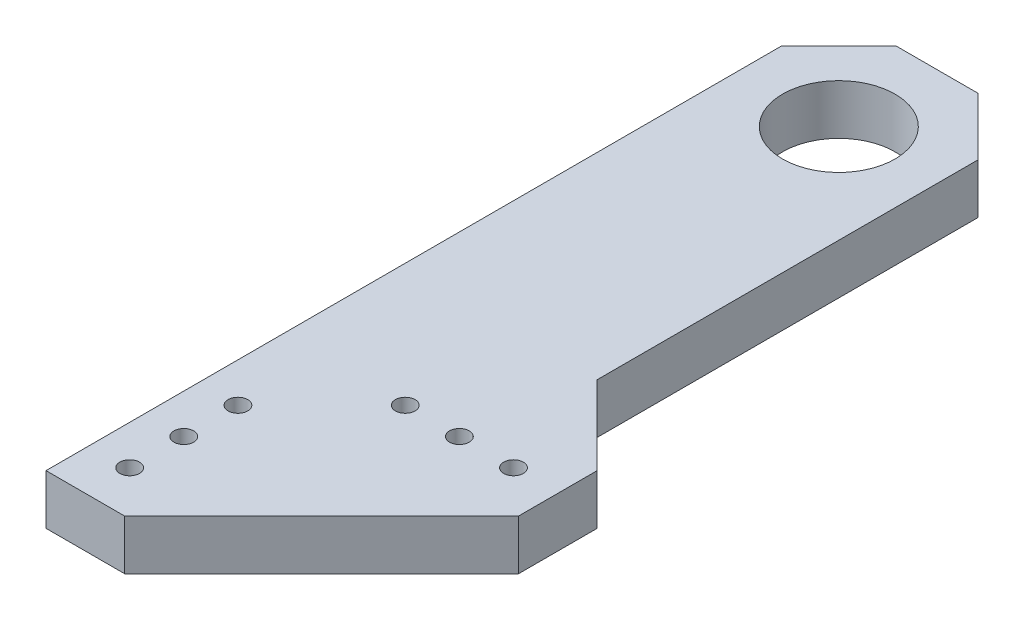
ISO-10303-21;
HEADER;
FILE_DESCRIPTION(('STEP AP214'),'2;1');
FILE_NAME('part.step','',(''),(''),'','','');
FILE_SCHEMA(('AUTOMOTIVE_DESIGN { 1 0 10303 214 1 1 1 1 }'));
ENDSEC;
DATA;
#1=APPLICATION_CONTEXT('core data for automotive mechanical design processes');
#2=APPLICATION_PROTOCOL_DEFINITION('international standard','automotive_design',2000,#1);
#3=PRODUCT_CONTEXT('',#1,'mechanical');
#4=PRODUCT('Part','Part','',(#3));
#5=PRODUCT_RELATED_PRODUCT_CATEGORY('part','',(#4));
#6=PRODUCT_DEFINITION_FORMATION('','',#4);
#7=PRODUCT_DEFINITION_CONTEXT('part definition',#1,'design');
#8=PRODUCT_DEFINITION('design','',#6,#7);
#9=PRODUCT_DEFINITION_SHAPE('','',#8);
#10=(LENGTH_UNIT() NAMED_UNIT(*) SI_UNIT(.MILLI.,.METRE.));
#11=(NAMED_UNIT(*) PLANE_ANGLE_UNIT() SI_UNIT($,.RADIAN.));
#12=(NAMED_UNIT(*) SI_UNIT($,.STERADIAN.) SOLID_ANGLE_UNIT());
#13=UNCERTAINTY_MEASURE_WITH_UNIT(LENGTH_MEASURE(1.E-05),#10,'distance_accuracy_value','');
#14=(GEOMETRIC_REPRESENTATION_CONTEXT(3) GLOBAL_UNCERTAINTY_ASSIGNED_CONTEXT((#13)) GLOBAL_UNIT_ASSIGNED_CONTEXT((#10,
#11,#12)) REPRESENTATION_CONTEXT('',''));
#15=CARTESIAN_POINT('',(0.,0.,0.));
#16=DIRECTION('',(0.,0.,1.));
#17=DIRECTION('',(1.,0.,0.));
#18=AXIS2_PLACEMENT_3D('',#15,#16,#17);
#19=CARTESIAN_POINT('',(0.,6.35,0.));
#20=DIRECTION('',(0.,1.,0.));
#21=DIRECTION('',(0.,0.,1.));
#22=AXIS2_PLACEMENT_3D('',#19,#20,#21);
#23=PLANE('',#22);
#24=CARTESIAN_POINT('',(0.,6.35,35.));
#25=DIRECTION('',(0.,1.,0.));
#26=DIRECTION('',(0.,0.,1.));
#27=AXIS2_PLACEMENT_3D('',#24,#25,#26);
#28=CIRCLE('',#27,2.5);
#29=CARTESIAN_POINT('',(0.,6.35,37.5));
#30=VERTEX_POINT('',#29);
#31=EDGE_CURVE('E222',#30,#30,#28,.T.);
#32=ORIENTED_EDGE('',*,*,#31,.F.);
#33=EDGE_LOOP('',(#32));
#34=FACE_BOUND('',#33,.T.);
#35=CARTESIAN_POINT('',(21.25,6.35,0.));
#36=DIRECTION('',(0.,1.,0.));
#37=DIRECTION('',(0.,0.,1.));
#38=AXIS2_PLACEMENT_3D('',#35,#36,#37);
#39=CIRCLE('',#38,2.5);
#40=CARTESIAN_POINT('',(21.25,6.35,2.5));
#41=VERTEX_POINT('',#40);
#42=EDGE_CURVE('E210',#41,#41,#39,.T.);
#43=ORIENTED_EDGE('',*,*,#42,.F.);
#44=EDGE_LOOP('',(#43));
#45=FACE_BOUND('',#44,.T.);
#46=CARTESIAN_POINT('',(48.75,6.35,0.));
#47=DIRECTION('',(0.,1.,0.));
#48=DIRECTION('',(0.,0.,1.));
#49=AXIS2_PLACEMENT_3D('',#46,#47,#48);
#50=CIRCLE('',#49,2.5);
#51=CARTESIAN_POINT('',(48.75,6.35,2.5));
#52=VERTEX_POINT('',#51);
#53=EDGE_CURVE('E198',#52,#52,#50,.T.);
#54=ORIENTED_EDGE('',*,*,#53,.F.);
#55=EDGE_LOOP('',(#54));
#56=FACE_BOUND('',#55,.T.);
#57=DIRECTION('',(0.,0.,1.));
#58=VECTOR('',#57,1.);
#59=CARTESIAN_POINT('',(-9.99999999999998,6.35,-126.725339059327));
#60=LINE('',#59,#58);
#61=CARTESIAN_POINT('',(-9.99999999999998,6.35,-126.725339059327));
#62=VERTEX_POINT('',#61);
#63=CARTESIAN_POINT('',(-10.,6.35,60.));
#64=VERTEX_POINT('',#63);
#65=EDGE_CURVE('E153',#62,#64,#60,.T.);
#66=ORIENTED_EDGE('',*,*,#65,.T.);
#67=DIRECTION('',(1.,0.,0.));
#68=VECTOR('',#67,1.);
#69=CARTESIAN_POINT('',(-10.,6.35,60.));
#70=LINE('',#69,#68);
#71=CARTESIAN_POINT('',(10.,6.35,60.));
#72=VERTEX_POINT('',#71);
#73=EDGE_CURVE('E96',#64,#72,#70,.T.);
#74=ORIENTED_EDGE('',*,*,#73,.T.);
#75=DIRECTION('',(0.707106781186548,0.,-0.707106781186547));
#76=VECTOR('',#75,1.);
#77=CARTESIAN_POINT('',(10.,6.35,60.));
#78=LINE('',#77,#76);
#79=CARTESIAN_POINT('',(60.,6.35,10.0000000000001));
#80=VERTEX_POINT('',#79);
#81=EDGE_CURVE('E171',#72,#80,#78,.T.);
#82=ORIENTED_EDGE('',*,*,#81,.T.);
#83=DIRECTION('',(0.,0.,-1.));
#84=VECTOR('',#83,1.);
#85=CARTESIAN_POINT('',(60.,6.35,10.0000000000001));
#86=LINE('',#85,#84);
#87=CARTESIAN_POINT('',(60.,6.35,-10.));
#88=VERTEX_POINT('',#87);
#89=EDGE_CURVE('E188',#80,#88,#86,.T.);
#90=ORIENTED_EDGE('',*,*,#89,.T.);
#91=DIRECTION('',(-0.707106781186548,0.,-0.707106781186548));
#92=VECTOR('',#91,1.);
#93=CARTESIAN_POINT('',(40.,6.35,-30.));
#94=LINE('',#93,#92);
#95=CARTESIAN_POINT('',(40.,6.35,-30.));
#96=VERTEX_POINT('',#95);
#97=EDGE_CURVE('E187',#88,#96,#94,.T.);
#98=ORIENTED_EDGE('',*,*,#97,.T.);
#99=DIRECTION('',(0.,0.,-1.));
#100=VECTOR('',#99,1.);
#101=CARTESIAN_POINT('',(40.,6.35,-126.725339059327));
#102=LINE('',#101,#100);
#103=CARTESIAN_POINT('',(40.,6.35,-126.725339059327));
#104=VERTEX_POINT('',#103);
#105=EDGE_CURVE('E118',#96,#104,#102,.T.);
#106=ORIENTED_EDGE('',*,*,#105,.T.);
#107=DIRECTION('',(-0.707106781186548,0.,-0.707106781186547));
#108=VECTOR('',#107,1.);
#109=CARTESIAN_POINT('',(25.3553390593274,6.35,-141.37));
#110=LINE('',#109,#108);
#111=CARTESIAN_POINT('',(25.3553390593274,6.35,-141.37));
#112=VERTEX_POINT('',#111);
#113=EDGE_CURVE('E112',#104,#112,#110,.T.);
#114=ORIENTED_EDGE('',*,*,#113,.T.);
#115=DIRECTION('',(-1.,0.,0.));
#116=VECTOR('',#115,1.);
#117=CARTESIAN_POINT('',(25.3553390593274,6.35,-141.37));
#118=LINE('',#117,#116);
#119=CARTESIAN_POINT('',(4.64466094067263,6.35,-141.37));
#120=VERTEX_POINT('',#119);
#121=EDGE_CURVE('E116',#112,#120,#118,.T.);
#122=ORIENTED_EDGE('',*,*,#121,.T.);
#123=DIRECTION('',(-0.707106781186548,0.,0.707106781186547));
#124=VECTOR('',#123,1.);
#125=CARTESIAN_POINT('',(4.64466094067263,6.35,-141.37));
#126=LINE('',#125,#124);
#127=EDGE_CURVE('E50',#120,#62,#126,.T.);
#128=ORIENTED_EDGE('',*,*,#127,.T.);
#129=EDGE_LOOP('',(#66,#74,#82,#90,#98,#106,#114,#122,#128));
#130=FACE_BOUND('',#129,.T.);
#131=CARTESIAN_POINT('',(15.,6.35,-116.37));
#132=DIRECTION('',(0.,1.,0.));
#133=DIRECTION('',(0.,0.,1.));
#134=AXIS2_PLACEMENT_3D('',#131,#132,#133);
#135=CIRCLE('',#134,14.2875);
#136=CARTESIAN_POINT('',(15.,6.35,-102.0825));
#137=VERTEX_POINT('',#136);
#138=EDGE_CURVE('E140',#137,#137,#135,.T.);
#139=ORIENTED_EDGE('',*,*,#138,.F.);
#140=EDGE_LOOP('',(#139));
#141=FACE_BOUND('',#140,.T.);
#142=CARTESIAN_POINT('',(35.,6.35,0.));
#143=DIRECTION('',(0.,1.,0.));
#144=DIRECTION('',(0.,0.,1.));
#145=AXIS2_PLACEMENT_3D('',#142,#143,#144);
#146=CIRCLE('',#145,2.5);
#147=CARTESIAN_POINT('',(35.,6.35,2.5));
#148=VERTEX_POINT('',#147);
#149=EDGE_CURVE('E204',#148,#148,#146,.T.);
#150=ORIENTED_EDGE('',*,*,#149,.F.);
#151=EDGE_LOOP('',(#150));
#152=FACE_BOUND('',#151,.T.);
#153=CARTESIAN_POINT('',(0.,6.35,48.75));
#154=DIRECTION('',(0.,1.,0.));
#155=DIRECTION('',(0.,0.,1.));
#156=AXIS2_PLACEMENT_3D('',#153,#154,#155);
#157=CIRCLE('',#156,2.5);
#158=CARTESIAN_POINT('',(0.,6.35,51.25));
#159=VERTEX_POINT('',#158);
#160=EDGE_CURVE('E216',#159,#159,#157,.T.);
#161=ORIENTED_EDGE('',*,*,#160,.F.);
#162=EDGE_LOOP('',(#161));
#163=FACE_BOUND('',#162,.T.);
#164=CARTESIAN_POINT('',(0.,6.35,21.25));
#165=DIRECTION('',(0.,1.,0.));
#166=DIRECTION('',(0.,0.,1.));
#167=AXIS2_PLACEMENT_3D('',#164,#165,#166);
#168=CIRCLE('',#167,2.5);
#169=CARTESIAN_POINT('',(0.,6.35,23.75));
#170=VERTEX_POINT('',#169);
#171=EDGE_CURVE('E228',#170,#170,#168,.T.);
#172=ORIENTED_EDGE('',*,*,#171,.F.);
#173=EDGE_LOOP('',(#172));
#174=FACE_BOUND('',#173,.T.);
#175=ADVANCED_FACE('F33',(#34,#45,#56,#130,#141,#152,#163,#174),#23,.T.);
#176=CARTESIAN_POINT('',(0.,-6.35,0.));
#177=DIRECTION('',(0.,1.,0.));
#178=DIRECTION('',(0.,0.,1.));
#179=AXIS2_PLACEMENT_3D('',#176,#177,#178);
#180=PLANE('',#179);
#181=DIRECTION('',(0.,0.,1.));
#182=VECTOR('',#181,1.);
#183=CARTESIAN_POINT('',(-9.99999999999998,-6.35,-126.725339059327));
#184=LINE('',#183,#182);
#185=CARTESIAN_POINT('',(-9.99999999999998,-6.35,-126.725339059327));
#186=VERTEX_POINT('',#185);
#187=CARTESIAN_POINT('',(-10.,-6.35,60.));
#188=VERTEX_POINT('',#187);
#189=EDGE_CURVE('E136',#186,#188,#184,.T.);
#190=ORIENTED_EDGE('',*,*,#189,.F.);
#191=DIRECTION('',(-0.707106781186548,0.,0.707106781186547));
#192=VECTOR('',#191,1.);
#193=CARTESIAN_POINT('',(4.64466094067263,-6.35,-141.37));
#194=LINE('',#193,#192);
#195=CARTESIAN_POINT('',(4.64466094067263,-6.35,-141.37));
#196=VERTEX_POINT('',#195);
#197=EDGE_CURVE('E88',#196,#186,#194,.T.);
#198=ORIENTED_EDGE('',*,*,#197,.F.);
#199=DIRECTION('',(-1.,0.,0.));
#200=VECTOR('',#199,1.);
#201=CARTESIAN_POINT('',(25.3553390593274,-6.35,-141.37));
#202=LINE('',#201,#200);
#203=CARTESIAN_POINT('',(25.3553390593274,-6.35,-141.37));
#204=VERTEX_POINT('',#203);
#205=EDGE_CURVE('E82',#204,#196,#202,.T.);
#206=ORIENTED_EDGE('',*,*,#205,.F.);
#207=DIRECTION('',(-0.707106781186548,0.,-0.707106781186547));
#208=VECTOR('',#207,1.);
#209=CARTESIAN_POINT('',(25.3553390593274,-6.35,-141.37));
#210=LINE('',#209,#208);
#211=CARTESIAN_POINT('',(40.,-6.35,-126.725339059327));
#212=VERTEX_POINT('',#211);
#213=EDGE_CURVE('E126',#212,#204,#210,.T.);
#214=ORIENTED_EDGE('',*,*,#213,.F.);
#215=DIRECTION('',(0.,0.,-1.));
#216=VECTOR('',#215,1.);
#217=CARTESIAN_POINT('',(40.,-6.35,-126.725339059327));
#218=LINE('',#217,#216);
#219=CARTESIAN_POINT('',(40.,-6.35,-30.));
#220=VERTEX_POINT('',#219);
#221=EDGE_CURVE('E148',#220,#212,#218,.T.);
#222=ORIENTED_EDGE('',*,*,#221,.F.);
#223=DIRECTION('',(-0.707106781186548,0.,-0.707106781186548));
#224=VECTOR('',#223,1.);
#225=CARTESIAN_POINT('',(40.,-6.35,-30.));
#226=LINE('',#225,#224);
#227=CARTESIAN_POINT('',(60.,-6.35,-10.));
#228=VERTEX_POINT('',#227);
#229=EDGE_CURVE('E146',#228,#220,#226,.T.);
#230=ORIENTED_EDGE('',*,*,#229,.F.);
#231=DIRECTION('',(0.,0.,-1.));
#232=VECTOR('',#231,1.);
#233=CARTESIAN_POINT('',(60.,-6.35,10.0000000000001));
#234=LINE('',#233,#232);
#235=CARTESIAN_POINT('',(60.,-6.35,10.0000000000001));
#236=VERTEX_POINT('',#235);
#237=EDGE_CURVE('E144',#236,#228,#234,.T.);
#238=ORIENTED_EDGE('',*,*,#237,.F.);
#239=DIRECTION('',(0.707106781186548,0.,-0.707106781186547));
#240=VECTOR('',#239,1.);
#241=CARTESIAN_POINT('',(10.,-6.35,60.));
#242=LINE('',#241,#240);
#243=CARTESIAN_POINT('',(10.,-6.35,60.));
#244=VERTEX_POINT('',#243);
#245=EDGE_CURVE('E142',#244,#236,#242,.T.);
#246=ORIENTED_EDGE('',*,*,#245,.F.);
#247=DIRECTION('',(1.,0.,0.));
#248=VECTOR('',#247,1.);
#249=CARTESIAN_POINT('',(-10.,-6.35,60.));
#250=LINE('',#249,#248);
#251=EDGE_CURVE('E139',#188,#244,#250,.T.);
#252=ORIENTED_EDGE('',*,*,#251,.F.);
#253=EDGE_LOOP('',(#190,#198,#206,#214,#222,#230,#238,#246,#252));
#254=FACE_BOUND('',#253,.T.);
#255=CARTESIAN_POINT('',(15.,-6.35,-116.37));
#256=DIRECTION('',(0.,1.,0.));
#257=DIRECTION('',(0.,0.,1.));
#258=AXIS2_PLACEMENT_3D('',#255,#256,#257);
#259=CIRCLE('',#258,14.2875);
#260=CARTESIAN_POINT('',(15.,-6.35,-102.0825));
#261=VERTEX_POINT('',#260);
#262=EDGE_CURVE('E195',#261,#261,#259,.T.);
#263=ORIENTED_EDGE('',*,*,#262,.T.);
#264=EDGE_LOOP('',(#263));
#265=FACE_BOUND('',#264,.T.);
#266=CARTESIAN_POINT('',(48.75,-6.35,0.));
#267=DIRECTION('',(0.,1.,0.));
#268=DIRECTION('',(0.,0.,1.));
#269=AXIS2_PLACEMENT_3D('',#266,#267,#268);
#270=CIRCLE('',#269,2.5);
#271=CARTESIAN_POINT('',(48.75,-6.35,2.5));
#272=VERTEX_POINT('',#271);
#273=EDGE_CURVE('E201',#272,#272,#270,.T.);
#274=ORIENTED_EDGE('',*,*,#273,.T.);
#275=EDGE_LOOP('',(#274));
#276=FACE_BOUND('',#275,.T.);
#277=CARTESIAN_POINT('',(35.,-6.35,0.));
#278=DIRECTION('',(0.,1.,0.));
#279=DIRECTION('',(0.,0.,1.));
#280=AXIS2_PLACEMENT_3D('',#277,#278,#279);
#281=CIRCLE('',#280,2.5);
#282=CARTESIAN_POINT('',(35.,-6.35,2.5));
#283=VERTEX_POINT('',#282);
#284=EDGE_CURVE('E207',#283,#283,#281,.T.);
#285=ORIENTED_EDGE('',*,*,#284,.T.);
#286=EDGE_LOOP('',(#285));
#287=FACE_BOUND('',#286,.T.);
#288=CARTESIAN_POINT('',(21.25,-6.35,0.));
#289=DIRECTION('',(0.,1.,0.));
#290=DIRECTION('',(0.,0.,1.));
#291=AXIS2_PLACEMENT_3D('',#288,#289,#290);
#292=CIRCLE('',#291,2.5);
#293=CARTESIAN_POINT('',(21.25,-6.35,2.5));
#294=VERTEX_POINT('',#293);
#295=EDGE_CURVE('E213',#294,#294,#292,.T.);
#296=ORIENTED_EDGE('',*,*,#295,.T.);
#297=EDGE_LOOP('',(#296));
#298=FACE_BOUND('',#297,.T.);
#299=CARTESIAN_POINT('',(0.,-6.35,48.75));
#300=DIRECTION('',(0.,1.,0.));
#301=DIRECTION('',(0.,0.,1.));
#302=AXIS2_PLACEMENT_3D('',#299,#300,#301);
#303=CIRCLE('',#302,2.5);
#304=CARTESIAN_POINT('',(0.,-6.35,51.25));
#305=VERTEX_POINT('',#304);
#306=EDGE_CURVE('E219',#305,#305,#303,.T.);
#307=ORIENTED_EDGE('',*,*,#306,.T.);
#308=EDGE_LOOP('',(#307));
#309=FACE_BOUND('',#308,.T.);
#310=CARTESIAN_POINT('',(0.,-6.35,35.));
#311=DIRECTION('',(0.,1.,0.));
#312=DIRECTION('',(0.,0.,1.));
#313=AXIS2_PLACEMENT_3D('',#310,#311,#312);
#314=CIRCLE('',#313,2.5);
#315=CARTESIAN_POINT('',(0.,-6.35,37.5));
#316=VERTEX_POINT('',#315);
#317=EDGE_CURVE('E225',#316,#316,#314,.T.);
#318=ORIENTED_EDGE('',*,*,#317,.T.);
#319=EDGE_LOOP('',(#318));
#320=FACE_BOUND('',#319,.T.);
#321=CARTESIAN_POINT('',(0.,-6.35,21.25));
#322=DIRECTION('',(0.,1.,0.));
#323=DIRECTION('',(0.,0.,1.));
#324=AXIS2_PLACEMENT_3D('',#321,#322,#323);
#325=CIRCLE('',#324,2.5);
#326=CARTESIAN_POINT('',(0.,-6.35,23.75));
#327=VERTEX_POINT('',#326);
#328=EDGE_CURVE('E231',#327,#327,#325,.T.);
#329=ORIENTED_EDGE('',*,*,#328,.T.);
#330=EDGE_LOOP('',(#329));
#331=FACE_BOUND('',#330,.T.);
#332=ADVANCED_FACE('F175',(#254,#265,#276,#287,#298,#309,#320,#331),#180,.F.);
#333=CARTESIAN_POINT('',(-9.99999999999998,6.35,-126.725339059327));
#334=DIRECTION('',(1.,0.,0.));
#335=DIRECTION('',(0.,0.,-1.));
#336=AXIS2_PLACEMENT_3D('',#333,#334,#335);
#337=PLANE('',#336);
#338=ORIENTED_EDGE('',*,*,#189,.T.);
#339=DIRECTION('',(0.,-1.,0.));
#340=VECTOR('',#339,1.);
#341=CARTESIAN_POINT('',(-10.,6.35,60.));
#342=LINE('',#341,#340);
#343=EDGE_CURVE('E11',#64,#188,#342,.T.);
#344=ORIENTED_EDGE('',*,*,#343,.F.);
#345=ORIENTED_EDGE('',*,*,#65,.F.);
#346=DIRECTION('',(0.,-1.,0.));
#347=VECTOR('',#346,1.);
#348=CARTESIAN_POINT('',(-9.99999999999998,6.35,-126.725339059327));
#349=LINE('',#348,#347);
#350=EDGE_CURVE('E132',#62,#186,#349,.T.);
#351=ORIENTED_EDGE('',*,*,#350,.T.);
#352=EDGE_LOOP('',(#338,#344,#345,#351));
#353=FACE_BOUND('',#352,.T.);
#354=ADVANCED_FACE('F35',(#353),#337,.F.);
#355=CARTESIAN_POINT('',(-10.,6.35,60.));
#356=DIRECTION('',(0.,0.,-1.));
#357=DIRECTION('',(-1.,0.,0.));
#358=AXIS2_PLACEMENT_3D('',#355,#356,#357);
#359=PLANE('',#358);
#360=ORIENTED_EDGE('',*,*,#251,.T.);
#361=DIRECTION('',(0.,-1.,0.));
#362=VECTOR('',#361,1.);
#363=CARTESIAN_POINT('',(10.,6.35,60.));
#364=LINE('',#363,#362);
#365=EDGE_CURVE('E42',#72,#244,#364,.T.);
#366=ORIENTED_EDGE('',*,*,#365,.F.);
#367=ORIENTED_EDGE('',*,*,#73,.F.);
#368=ORIENTED_EDGE('',*,*,#343,.T.);
#369=EDGE_LOOP('',(#360,#366,#367,#368));
#370=FACE_BOUND('',#369,.T.);
#371=ADVANCED_FACE('F269',(#370),#359,.F.);
#372=CARTESIAN_POINT('',(10.,6.35,60.));
#373=DIRECTION('',(-0.707106781186547,0.,-0.707106781186548));
#374=DIRECTION('',(-0.707106781186548,0.,0.707106781186547));
#375=AXIS2_PLACEMENT_3D('',#372,#373,#374);
#376=PLANE('',#375);
#377=ORIENTED_EDGE('',*,*,#245,.T.);
#378=DIRECTION('',(0.,-1.,0.));
#379=VECTOR('',#378,1.);
#380=CARTESIAN_POINT('',(60.,6.35,10.0000000000001));
#381=LINE('',#380,#379);
#382=EDGE_CURVE('E163',#80,#236,#381,.T.);
#383=ORIENTED_EDGE('',*,*,#382,.F.);
#384=ORIENTED_EDGE('',*,*,#81,.F.);
#385=ORIENTED_EDGE('',*,*,#365,.T.);
#386=EDGE_LOOP('',(#377,#383,#384,#385));
#387=FACE_BOUND('',#386,.T.);
#388=ADVANCED_FACE('F169',(#387),#376,.F.);
#389=CARTESIAN_POINT('',(60.,6.35,10.0000000000001));
#390=DIRECTION('',(-1.,0.,0.));
#391=DIRECTION('',(0.,0.,1.));
#392=AXIS2_PLACEMENT_3D('',#389,#390,#391);
#393=PLANE('',#392);
#394=ORIENTED_EDGE('',*,*,#237,.T.);
#395=DIRECTION('',(0.,-1.,0.));
#396=VECTOR('',#395,1.);
#397=CARTESIAN_POINT('',(60.,6.35,-10.));
#398=LINE('',#397,#396);
#399=EDGE_CURVE('E160',#88,#228,#398,.T.);
#400=ORIENTED_EDGE('',*,*,#399,.F.);
#401=ORIENTED_EDGE('',*,*,#89,.F.);
#402=ORIENTED_EDGE('',*,*,#382,.T.);
#403=EDGE_LOOP('',(#394,#400,#401,#402));
#404=FACE_BOUND('',#403,.T.);
#405=ADVANCED_FACE('F181',(#404),#393,.F.);
#406=CARTESIAN_POINT('',(40.,6.35,-30.));
#407=DIRECTION('',(-0.707106781186548,0.,0.707106781186548));
#408=DIRECTION('',(0.707106781186548,0.,0.707106781186548));
#409=AXIS2_PLACEMENT_3D('',#406,#407,#408);
#410=PLANE('',#409);
#411=ORIENTED_EDGE('',*,*,#229,.T.);
#412=DIRECTION('',(0.,-1.,0.));
#413=VECTOR('',#412,1.);
#414=CARTESIAN_POINT('',(40.,6.35,-30.));
#415=LINE('',#414,#413);
#416=EDGE_CURVE('E157',#96,#220,#415,.T.);
#417=ORIENTED_EDGE('',*,*,#416,.F.);
#418=ORIENTED_EDGE('',*,*,#97,.F.);
#419=ORIENTED_EDGE('',*,*,#399,.T.);
#420=EDGE_LOOP('',(#411,#417,#418,#419));
#421=FACE_BOUND('',#420,.T.);
#422=ADVANCED_FACE('F185',(#421),#410,.F.);
#423=CARTESIAN_POINT('',(40.,6.35,-126.725339059327));
#424=DIRECTION('',(-1.,0.,0.));
#425=DIRECTION('',(0.,0.,1.));
#426=AXIS2_PLACEMENT_3D('',#423,#424,#425);
#427=PLANE('',#426);
#428=ORIENTED_EDGE('',*,*,#221,.T.);
#429=DIRECTION('',(0.,-1.,0.));
#430=VECTOR('',#429,1.);
#431=CARTESIAN_POINT('',(40.,6.35,-126.725339059327));
#432=LINE('',#431,#430);
#433=EDGE_CURVE('E127',#104,#212,#432,.T.);
#434=ORIENTED_EDGE('',*,*,#433,.F.);
#435=ORIENTED_EDGE('',*,*,#105,.F.);
#436=ORIENTED_EDGE('',*,*,#416,.T.);
#437=EDGE_LOOP('',(#428,#434,#435,#436));
#438=FACE_BOUND('',#437,.T.);
#439=ADVANCED_FACE('F260',(#438),#427,.F.);
#440=CARTESIAN_POINT('',(25.3553390593274,6.35,-141.37));
#441=DIRECTION('',(-0.707106781186547,0.,0.707106781186548));
#442=DIRECTION('',(0.707106781186548,0.,0.707106781186547));
#443=AXIS2_PLACEMENT_3D('',#440,#441,#442);
#444=PLANE('',#443);
#445=ORIENTED_EDGE('',*,*,#213,.T.);
#446=DIRECTION('',(0.,-1.,0.));
#447=VECTOR('',#446,1.);
#448=CARTESIAN_POINT('',(25.3553390593274,6.35,-141.37));
#449=LINE('',#448,#447);
#450=EDGE_CURVE('E123',#112,#204,#449,.T.);
#451=ORIENTED_EDGE('',*,*,#450,.F.);
#452=ORIENTED_EDGE('',*,*,#113,.F.);
#453=ORIENTED_EDGE('',*,*,#433,.T.);
#454=EDGE_LOOP('',(#445,#451,#452,#453));
#455=FACE_BOUND('',#454,.T.);
#456=ADVANCED_FACE('F124',(#455),#444,.F.);
#457=CARTESIAN_POINT('',(25.3553390593274,6.35,-141.37));
#458=DIRECTION('',(0.,0.,1.));
#459=DIRECTION('',(1.,0.,0.));
#460=AXIS2_PLACEMENT_3D('',#457,#458,#459);
#461=PLANE('',#460);
#462=ORIENTED_EDGE('',*,*,#205,.T.);
#463=DIRECTION('',(0.,-1.,0.));
#464=VECTOR('',#463,1.);
#465=CARTESIAN_POINT('',(4.64466094067263,6.35,-141.37));
#466=LINE('',#465,#464);
#467=EDGE_CURVE('E128',#120,#196,#466,.T.);
#468=ORIENTED_EDGE('',*,*,#467,.F.);
#469=ORIENTED_EDGE('',*,*,#121,.F.);
#470=ORIENTED_EDGE('',*,*,#450,.T.);
#471=EDGE_LOOP('',(#462,#468,#469,#470));
#472=FACE_BOUND('',#471,.T.);
#473=ADVANCED_FACE('F130',(#472),#461,.F.);
#474=CARTESIAN_POINT('',(4.64466094067263,6.35,-141.37));
#475=DIRECTION('',(0.707106781186547,0.,0.707106781186548));
#476=DIRECTION('',(0.707106781186548,0.,-0.707106781186547));
#477=AXIS2_PLACEMENT_3D('',#474,#475,#476);
#478=PLANE('',#477);
#479=ORIENTED_EDGE('',*,*,#197,.T.);
#480=ORIENTED_EDGE('',*,*,#350,.F.);
#481=ORIENTED_EDGE('',*,*,#127,.F.);
#482=ORIENTED_EDGE('',*,*,#467,.T.);
#483=EDGE_LOOP('',(#479,#480,#481,#482));
#484=FACE_BOUND('',#483,.T.);
#485=ADVANCED_FACE('F253',(#484),#478,.F.);
#486=CARTESIAN_POINT('',(15.,6.35,-116.37));
#487=DIRECTION('',(0.,-1.,0.));
#488=DIRECTION('',(0.,0.,-1.));
#489=AXIS2_PLACEMENT_3D('',#486,#487,#488);
#490=CYLINDRICAL_SURFACE('',#489,14.2875);
#491=ORIENTED_EDGE('',*,*,#138,.T.);
#492=EDGE_LOOP('',(#491));
#493=FACE_BOUND('',#492,.T.);
#494=ORIENTED_EDGE('',*,*,#262,.F.);
#495=EDGE_LOOP('',(#494));
#496=FACE_BOUND('',#495,.T.);
#497=ADVANCED_FACE('F250',(#493,#496),#490,.F.);
#498=CARTESIAN_POINT('',(48.75,6.35,0.));
#499=DIRECTION('',(0.,-1.,0.));
#500=DIRECTION('',(0.,0.,-1.));
#501=AXIS2_PLACEMENT_3D('',#498,#499,#500);
#502=CYLINDRICAL_SURFACE('',#501,2.5);
#503=ORIENTED_EDGE('',*,*,#53,.T.);
#504=EDGE_LOOP('',(#503));
#505=FACE_BOUND('',#504,.T.);
#506=ORIENTED_EDGE('',*,*,#273,.F.);
#507=EDGE_LOOP('',(#506));
#508=FACE_BOUND('',#507,.T.);
#509=ADVANCED_FACE('F338',(#505,#508),#502,.F.);
#510=CARTESIAN_POINT('',(35.,6.35,0.));
#511=DIRECTION('',(0.,-1.,0.));
#512=DIRECTION('',(0.,0.,-1.));
#513=AXIS2_PLACEMENT_3D('',#510,#511,#512);
#514=CYLINDRICAL_SURFACE('',#513,2.5);
#515=ORIENTED_EDGE('',*,*,#149,.T.);
#516=EDGE_LOOP('',(#515));
#517=FACE_BOUND('',#516,.T.);
#518=ORIENTED_EDGE('',*,*,#284,.F.);
#519=EDGE_LOOP('',(#518));
#520=FACE_BOUND('',#519,.T.);
#521=ADVANCED_FACE('F346',(#517,#520),#514,.F.);
#522=CARTESIAN_POINT('',(21.25,6.35,0.));
#523=DIRECTION('',(0.,-1.,0.));
#524=DIRECTION('',(0.,0.,-1.));
#525=AXIS2_PLACEMENT_3D('',#522,#523,#524);
#526=CYLINDRICAL_SURFACE('',#525,2.5);
#527=ORIENTED_EDGE('',*,*,#42,.T.);
#528=EDGE_LOOP('',(#527));
#529=FACE_BOUND('',#528,.T.);
#530=ORIENTED_EDGE('',*,*,#295,.F.);
#531=EDGE_LOOP('',(#530));
#532=FACE_BOUND('',#531,.T.);
#533=ADVANCED_FACE('F354',(#529,#532),#526,.F.);
#534=CARTESIAN_POINT('',(0.,6.35,48.75));
#535=DIRECTION('',(0.,-1.,0.));
#536=DIRECTION('',(0.,0.,-1.));
#537=AXIS2_PLACEMENT_3D('',#534,#535,#536);
#538=CYLINDRICAL_SURFACE('',#537,2.5);
#539=ORIENTED_EDGE('',*,*,#160,.T.);
#540=EDGE_LOOP('',(#539));
#541=FACE_BOUND('',#540,.T.);
#542=ORIENTED_EDGE('',*,*,#306,.F.);
#543=EDGE_LOOP('',(#542));
#544=FACE_BOUND('',#543,.T.);
#545=ADVANCED_FACE('F363',(#541,#544),#538,.F.);
#546=CARTESIAN_POINT('',(0.,6.35,35.));
#547=DIRECTION('',(0.,-1.,0.));
#548=DIRECTION('',(0.,0.,-1.));
#549=AXIS2_PLACEMENT_3D('',#546,#547,#548);
#550=CYLINDRICAL_SURFACE('',#549,2.5);
#551=ORIENTED_EDGE('',*,*,#31,.T.);
#552=EDGE_LOOP('',(#551));
#553=FACE_BOUND('',#552,.T.);
#554=ORIENTED_EDGE('',*,*,#317,.F.);
#555=EDGE_LOOP('',(#554));
#556=FACE_BOUND('',#555,.T.);
#557=ADVANCED_FACE('F372',(#553,#556),#550,.F.);
#558=CARTESIAN_POINT('',(0.,6.35,21.25));
#559=DIRECTION('',(0.,-1.,0.));
#560=DIRECTION('',(0.,0.,-1.));
#561=AXIS2_PLACEMENT_3D('',#558,#559,#560);
#562=CYLINDRICAL_SURFACE('',#561,2.5);
#563=ORIENTED_EDGE('',*,*,#171,.T.);
#564=EDGE_LOOP('',(#563));
#565=FACE_BOUND('',#564,.T.);
#566=ORIENTED_EDGE('',*,*,#328,.F.);
#567=EDGE_LOOP('',(#566));
#568=FACE_BOUND('',#567,.T.);
#569=ADVANCED_FACE('F237',(#565,#568),#562,.F.);
#570=CLOSED_SHELL('',(#175,#332,#354,#371,#388,#405,#422,#439,#456,#473,#485,#497,#509,#521,
#533,#545,#557,#569));
#571=MANIFOLD_SOLID_BREP('B2',#570);
#572=ADVANCED_BREP_SHAPE_REPRESENTATION('',(#18,#571),#14);
#573=SHAPE_DEFINITION_REPRESENTATION(#9,#572);
ENDSEC;
END-ISO-10303-21;
